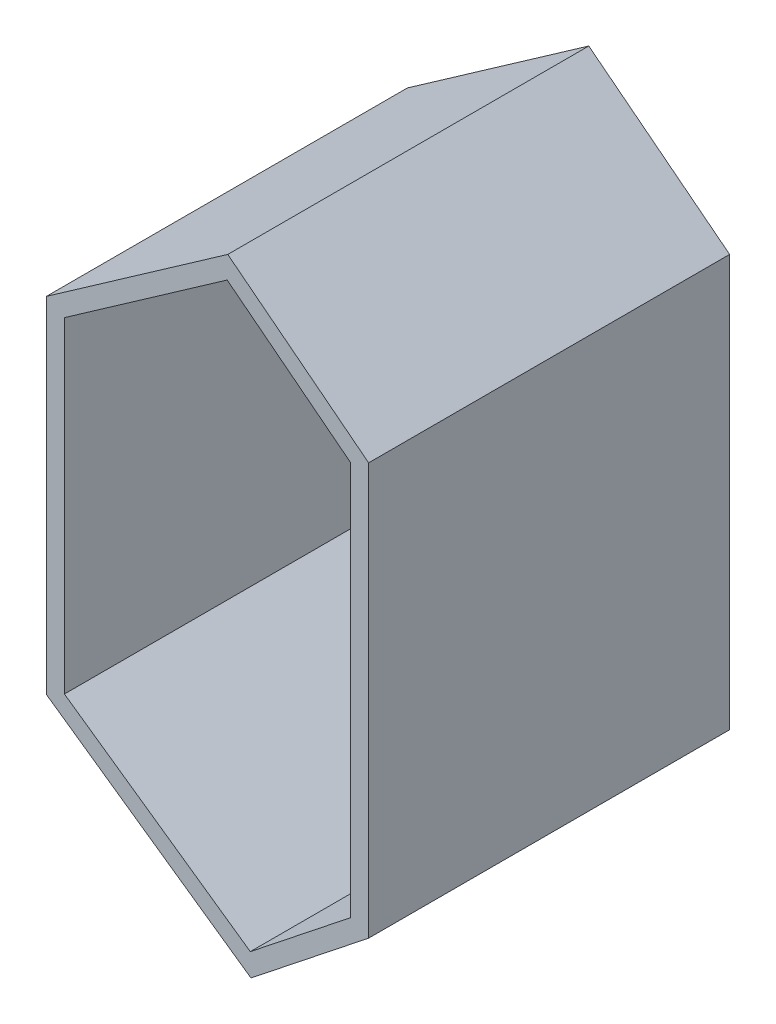
ISO-10303-21;
HEADER;
FILE_DESCRIPTION(('STEP AP214'),'2;1');
FILE_NAME('part.step','',(''),(''),'','','');
FILE_SCHEMA(('AUTOMOTIVE_DESIGN { 1 0 10303 214 1 1 1 1 }'));
ENDSEC;
DATA;
#1=APPLICATION_CONTEXT('core data for automotive mechanical design processes');
#2=APPLICATION_PROTOCOL_DEFINITION('international standard','automotive_design',2000,#1);
#3=PRODUCT_CONTEXT('',#1,'mechanical');
#4=PRODUCT('Part','Part','',(#3));
#5=PRODUCT_RELATED_PRODUCT_CATEGORY('part','',(#4));
#6=PRODUCT_DEFINITION_FORMATION('','',#4);
#7=PRODUCT_DEFINITION_CONTEXT('part definition',#1,'design');
#8=PRODUCT_DEFINITION('design','',#6,#7);
#9=PRODUCT_DEFINITION_SHAPE('','',#8);
#10=(LENGTH_UNIT() NAMED_UNIT(*) SI_UNIT(.MILLI.,.METRE.));
#11=(NAMED_UNIT(*) PLANE_ANGLE_UNIT() SI_UNIT($,.RADIAN.));
#12=(NAMED_UNIT(*) SI_UNIT($,.STERADIAN.) SOLID_ANGLE_UNIT());
#13=UNCERTAINTY_MEASURE_WITH_UNIT(LENGTH_MEASURE(1.E-05),#10,'distance_accuracy_value','');
#14=(GEOMETRIC_REPRESENTATION_CONTEXT(3) GLOBAL_UNCERTAINTY_ASSIGNED_CONTEXT((#13)) GLOBAL_UNIT_ASSIGNED_CONTEXT((#10,
#11,#12)) REPRESENTATION_CONTEXT('',''));
#15=CARTESIAN_POINT('',(0.,0.,0.));
#16=DIRECTION('',(0.,0.,1.));
#17=DIRECTION('',(1.,0.,0.));
#18=AXIS2_PLACEMENT_3D('',#15,#16,#17);
#19=CARTESIAN_POINT('',(0.,0.,12.));
#20=DIRECTION('',(0.,0.,1.));
#21=DIRECTION('',(1.,0.,0.));
#22=AXIS2_PLACEMENT_3D('',#19,#20,#21);
#23=PLANE('',#22);
#24=DIRECTION('',(0.,1.,0.));
#25=VECTOR('',#24,1.);
#26=CARTESIAN_POINT('',(23.0022153114489,-29.371596289084,12.));
#27=LINE('',#26,#25);
#28=CARTESIAN_POINT('',(23.0022153114489,-43.0552113023601,12.));
#29=VERTEX_POINT('',#28);
#30=CARTESIAN_POINT('',(23.0022153114489,-29.371596289084,12.));
#31=VERTEX_POINT('',#30);
#32=EDGE_CURVE('E175',#29,#31,#27,.T.);
#33=ORIENTED_EDGE('',*,*,#32,.T.);
#34=DIRECTION('',(-0.788010753606723,0.615661475325657,0.));
#35=VECTOR('',#34,1.);
#36=CARTESIAN_POINT('',(23.0022153114489,-29.371596289084,12.));
#37=LINE('',#36,#35);
#38=CARTESIAN_POINT('',(18.3200530199619,-25.7134901897735,12.));
#39=VERTEX_POINT('',#38);
#40=EDGE_CURVE('E178',#31,#39,#37,.T.);
#41=ORIENTED_EDGE('',*,*,#40,.T.);
#42=DIRECTION('',(-0.819152044288996,-0.57357643635104,0.));
#43=VECTOR('',#42,1.);
#44=CARTESIAN_POINT('',(18.3200530199619,-25.7134901897735,12.));
#45=LINE('',#44,#43);
#46=CARTESIAN_POINT('',(12.2903213629814,-29.935553749373,12.));
#47=VERTEX_POINT('',#46);
#48=EDGE_CURVE('E181',#39,#47,#45,.T.);
#49=ORIENTED_EDGE('',*,*,#48,.T.);
#50=DIRECTION('',(0.,-1.,0.));
#51=VECTOR('',#50,1.);
#52=CARTESIAN_POINT('',(12.2903213629814,-29.935553749373,12.));
#53=LINE('',#52,#51);
#54=CARTESIAN_POINT('',(12.2903213629814,-41.394710348046,12.));
#55=VERTEX_POINT('',#54);
#56=EDGE_CURVE('E183',#47,#55,#53,.T.);
#57=ORIENTED_EDGE('',*,*,#56,.T.);
#58=DIRECTION('',(0.819152044288993,-0.573576436351043,0.));
#59=VECTOR('',#58,1.);
#60=CARTESIAN_POINT('',(12.2903213629814,-41.394710348046,12.));
#61=LINE('',#60,#59);
#62=CARTESIAN_POINT('',(19.0912538792578,-46.1567745627982,12.));
#63=VERTEX_POINT('',#62);
#64=EDGE_CURVE('E185',#55,#63,#61,.T.);
#65=ORIENTED_EDGE('',*,*,#64,.T.);
#66=DIRECTION('',(0.783520476758646,0.621365965031803,0.));
#67=VECTOR('',#66,1.);
#68=CARTESIAN_POINT('',(23.0022153114489,-43.0552113023601,12.));
#69=LINE('',#68,#67);
#70=EDGE_CURVE('E187',#63,#29,#69,.T.);
#71=ORIENTED_EDGE('',*,*,#70,.T.);
#72=EDGE_LOOP('',(#33,#41,#49,#57,#65,#71));
#73=FACE_BOUND('',#72,.T.);
#74=DIRECTION('',(0.,-1.,0.));
#75=VECTOR('',#74,1.);
#76=CARTESIAN_POINT('',(12.8903213629814,-30.247893979704,12.));
#77=LINE('',#76,#75);
#78=CARTESIAN_POINT('',(12.8903213629814,-30.247893979704,12.));
#79=VERTEX_POINT('',#78);
#80=CARTESIAN_POINT('',(12.8903213629814,-41.082370117715,12.));
#81=VERTEX_POINT('',#80);
#82=EDGE_CURVE('E130',#79,#81,#77,.T.);
#83=ORIENTED_EDGE('',*,*,#82,.F.);
#84=DIRECTION('',(-0.819152044288999,-0.573576436351036,0.));
#85=VECTOR('',#84,1.);
#86=CARTESIAN_POINT('',(18.3005145053902,-26.4596359582189,12.));
#87=LINE('',#86,#85);
#88=CARTESIAN_POINT('',(18.3005145053902,-26.4596359582189,12.));
#89=VERTEX_POINT('',#88);
#90=EDGE_CURVE('E122',#89,#79,#87,.T.);
#91=ORIENTED_EDGE('',*,*,#90,.F.);
#92=DIRECTION('',(-0.788010753606723,0.615661475325657,0.));
#93=VECTOR('',#92,1.);
#94=CARTESIAN_POINT('',(22.4022153114489,-29.6642358422236,12.));
#95=LINE('',#94,#93);
#96=CARTESIAN_POINT('',(22.4022153114489,-29.6642358422236,12.));
#97=VERTEX_POINT('',#96);
#98=EDGE_CURVE('E152',#97,#89,#95,.T.);
#99=ORIENTED_EDGE('',*,*,#98,.F.);
#100=DIRECTION('',(0.,1.,0.));
#101=VECTOR('',#100,1.);
#102=CARTESIAN_POINT('',(22.4022153114489,-29.6642358422236,12.));
#103=LINE('',#102,#101);
#104=CARTESIAN_POINT('',(22.4022153114489,-42.7652630141919,12.));
#105=VERTEX_POINT('',#104);
#106=EDGE_CURVE('E150',#105,#97,#103,.T.);
#107=ORIENTED_EDGE('',*,*,#106,.F.);
#108=DIRECTION('',(0.783520476758647,0.621365965031802,0.));
#109=VECTOR('',#108,1.);
#110=CARTESIAN_POINT('',(22.4022153114489,-42.7652630141919,12.));
#111=LINE('',#110,#109);
#112=CARTESIAN_POINT('',(19.0689470198622,-45.4086903784388,12.));
#113=VERTEX_POINT('',#112);
#114=EDGE_CURVE('E146',#113,#105,#111,.T.);
#115=ORIENTED_EDGE('',*,*,#114,.F.);
#116=DIRECTION('',(0.819152044288994,-0.573576436351043,0.));
#117=VECTOR('',#116,1.);
#118=CARTESIAN_POINT('',(12.8903213629814,-41.082370117715,12.));
#119=LINE('',#118,#117);
#120=EDGE_CURVE('E144',#81,#113,#119,.T.);
#121=ORIENTED_EDGE('',*,*,#120,.F.);
#122=EDGE_LOOP('',(#83,#91,#99,#107,#115,#121));
#123=FACE_BOUND('',#122,.T.);
#124=ADVANCED_FACE('F35',(#73,#123),#23,.T.);
#125=CARTESIAN_POINT('',(0.,0.,0.));
#126=DIRECTION('',(0.,0.,1.));
#127=DIRECTION('',(1.,0.,0.));
#128=AXIS2_PLACEMENT_3D('',#125,#126,#127);
#129=PLANE('',#128);
#130=DIRECTION('',(0.,1.,0.));
#131=VECTOR('',#130,1.);
#132=CARTESIAN_POINT('',(23.0022153114489,-29.371596289084,0.));
#133=LINE('',#132,#131);
#134=CARTESIAN_POINT('',(23.0022153114489,-43.0552113023601,0.));
#135=VERTEX_POINT('',#134);
#136=CARTESIAN_POINT('',(23.0022153114489,-29.371596289084,0.));
#137=VERTEX_POINT('',#136);
#138=EDGE_CURVE('E139',#135,#137,#133,.T.);
#139=ORIENTED_EDGE('',*,*,#138,.F.);
#140=DIRECTION('',(0.783520476758646,0.621365965031803,0.));
#141=VECTOR('',#140,1.);
#142=CARTESIAN_POINT('',(23.0022153114489,-43.0552113023601,0.));
#143=LINE('',#142,#141);
#144=CARTESIAN_POINT('',(19.0912538792578,-46.1567745627982,0.));
#145=VERTEX_POINT('',#144);
#146=EDGE_CURVE('E179',#145,#135,#143,.T.);
#147=ORIENTED_EDGE('',*,*,#146,.F.);
#148=DIRECTION('',(0.819152044288993,-0.573576436351043,0.));
#149=VECTOR('',#148,1.);
#150=CARTESIAN_POINT('',(12.2903213629814,-41.394710348046,0.));
#151=LINE('',#150,#149);
#152=CARTESIAN_POINT('',(12.2903213629814,-41.394710348046,0.));
#153=VERTEX_POINT('',#152);
#154=EDGE_CURVE('E199',#153,#145,#151,.T.);
#155=ORIENTED_EDGE('',*,*,#154,.F.);
#156=DIRECTION('',(0.,-1.,0.));
#157=VECTOR('',#156,1.);
#158=CARTESIAN_POINT('',(12.2903213629814,-29.935553749373,0.));
#159=LINE('',#158,#157);
#160=CARTESIAN_POINT('',(12.2903213629814,-29.935553749373,0.));
#161=VERTEX_POINT('',#160);
#162=EDGE_CURVE('E197',#161,#153,#159,.T.);
#163=ORIENTED_EDGE('',*,*,#162,.F.);
#164=DIRECTION('',(-0.819152044288993,-0.573576436351044,0.));
#165=VECTOR('',#164,1.);
#166=CARTESIAN_POINT('',(17.8061046959484,-26.0733606804981,0.));
#167=LINE('',#166,#165);
#168=CARTESIAN_POINT('',(18.3200530199619,-25.7134901897735,0.));
#169=VERTEX_POINT('',#168);
#170=EDGE_CURVE('E195',#169,#161,#167,.T.);
#171=ORIENTED_EDGE('',*,*,#170,.F.);
#172=DIRECTION('',(-0.788010753606723,0.615661475325657,0.));
#173=VECTOR('',#172,1.);
#174=CARTESIAN_POINT('',(23.0022153114489,-29.371596289084,0.));
#175=LINE('',#174,#173);
#176=EDGE_CURVE('E192',#137,#169,#175,.T.);
#177=ORIENTED_EDGE('',*,*,#176,.F.);
#178=EDGE_LOOP('',(#139,#147,#155,#163,#171,#177));
#179=FACE_BOUND('',#178,.T.);
#180=DIRECTION('',(-0.819152044288993,-0.573576436351044,0.));
#181=VECTOR('',#180,1.);
#182=CARTESIAN_POINT('',(18.150250557759,-26.5648519070715,0.));
#183=LINE('',#182,#181);
#184=CARTESIAN_POINT('',(18.3005145053902,-26.4596359582189,0.));
#185=VERTEX_POINT('',#184);
#186=CARTESIAN_POINT('',(12.8903213629814,-30.247893979704,0.));
#187=VERTEX_POINT('',#186);
#188=EDGE_CURVE('E154',#185,#187,#183,.T.);
#189=ORIENTED_EDGE('',*,*,#188,.T.);
#190=DIRECTION('',(0.,-1.,0.));
#191=VECTOR('',#190,1.);
#192=CARTESIAN_POINT('',(12.8903213629814,-30.247893979704,0.));
#193=LINE('',#192,#191);
#194=CARTESIAN_POINT('',(12.8903213629814,-41.082370117715,0.));
#195=VERTEX_POINT('',#194);
#196=EDGE_CURVE('E137',#187,#195,#193,.T.);
#197=ORIENTED_EDGE('',*,*,#196,.T.);
#198=DIRECTION('',(0.819152044288994,-0.573576436351043,0.));
#199=VECTOR('',#198,1.);
#200=CARTESIAN_POINT('',(12.8903213629814,-41.082370117715,0.));
#201=LINE('',#200,#199);
#202=CARTESIAN_POINT('',(19.0689470198622,-45.4086903784388,0.));
#203=VERTEX_POINT('',#202);
#204=EDGE_CURVE('E157',#195,#203,#201,.T.);
#205=ORIENTED_EDGE('',*,*,#204,.T.);
#206=DIRECTION('',(0.783520476758647,0.621365965031802,0.));
#207=VECTOR('',#206,1.);
#208=CARTESIAN_POINT('',(22.4022153114489,-42.7652630141919,0.));
#209=LINE('',#208,#207);
#210=CARTESIAN_POINT('',(22.4022153114489,-42.7652630141919,0.));
#211=VERTEX_POINT('',#210);
#212=EDGE_CURVE('E160',#203,#211,#209,.T.);
#213=ORIENTED_EDGE('',*,*,#212,.T.);
#214=DIRECTION('',(0.,1.,0.));
#215=VECTOR('',#214,1.);
#216=CARTESIAN_POINT('',(22.4022153114489,-29.6642358422236,0.));
#217=LINE('',#216,#215);
#218=CARTESIAN_POINT('',(22.4022153114489,-29.6642358422236,0.));
#219=VERTEX_POINT('',#218);
#220=EDGE_CURVE('E163',#211,#219,#217,.T.);
#221=ORIENTED_EDGE('',*,*,#220,.T.);
#222=DIRECTION('',(-0.788010753606723,0.615661475325657,0.));
#223=VECTOR('',#222,1.);
#224=CARTESIAN_POINT('',(22.4022153114489,-29.6642358422236,0.));
#225=LINE('',#224,#223);
#226=EDGE_CURVE('E131',#219,#185,#225,.T.);
#227=ORIENTED_EDGE('',*,*,#226,.T.);
#228=EDGE_LOOP('',(#189,#197,#205,#213,#221,#227));
#229=FACE_BOUND('',#228,.T.);
#230=ADVANCED_FACE('F223',(#179,#229),#129,.F.);
#231=CARTESIAN_POINT('',(23.0022153114489,-29.371596289084,12.));
#232=DIRECTION('',(-1.,0.,0.));
#233=DIRECTION('',(0.,-1.,0.));
#234=AXIS2_PLACEMENT_3D('',#231,#232,#233);
#235=PLANE('',#234);
#236=ORIENTED_EDGE('',*,*,#138,.T.);
#237=DIRECTION('',(0.,0.,-1.));
#238=VECTOR('',#237,1.);
#239=CARTESIAN_POINT('',(23.0022153114489,-29.371596289084,12.));
#240=LINE('',#239,#238);
#241=EDGE_CURVE('E11',#31,#137,#240,.T.);
#242=ORIENTED_EDGE('',*,*,#241,.F.);
#243=ORIENTED_EDGE('',*,*,#32,.F.);
#244=DIRECTION('',(0.,0.,-1.));
#245=VECTOR('',#244,1.);
#246=CARTESIAN_POINT('',(23.0022153114489,-43.0552113023601,12.));
#247=LINE('',#246,#245);
#248=EDGE_CURVE('E189',#29,#135,#247,.T.);
#249=ORIENTED_EDGE('',*,*,#248,.T.);
#250=EDGE_LOOP('',(#236,#242,#243,#249));
#251=FACE_BOUND('',#250,.T.);
#252=ADVANCED_FACE('F37',(#251),#235,.F.);
#253=CARTESIAN_POINT('',(23.0022153114489,-29.371596289084,12.));
#254=DIRECTION('',(-0.615661475325657,-0.788010753606723,0.));
#255=DIRECTION('',(0.788010753606723,-0.615661475325657,0.));
#256=AXIS2_PLACEMENT_3D('',#253,#254,#255);
#257=PLANE('',#256);
#258=ORIENTED_EDGE('',*,*,#176,.T.);
#259=DIRECTION('',(0.,0.,-1.));
#260=VECTOR('',#259,1.);
#261=CARTESIAN_POINT('',(18.3200530199619,-25.7134901897735,12.));
#262=LINE('',#261,#260);
#263=EDGE_CURVE('E43',#39,#169,#262,.T.);
#264=ORIENTED_EDGE('',*,*,#263,.F.);
#265=ORIENTED_EDGE('',*,*,#40,.F.);
#266=ORIENTED_EDGE('',*,*,#241,.T.);
#267=EDGE_LOOP('',(#258,#264,#265,#266));
#268=FACE_BOUND('',#267,.T.);
#269=ADVANCED_FACE('F219',(#268),#257,.F.);
#270=CARTESIAN_POINT('',(17.8061046959484,-26.0733606804981,12.));
#271=DIRECTION('',(0.573576436351044,-0.819152044288993,0.));
#272=DIRECTION('',(0.819152044288994,0.573576436351044,0.));
#273=AXIS2_PLACEMENT_3D('',#270,#271,#272);
#274=PLANE('',#273);
#275=ORIENTED_EDGE('',*,*,#170,.T.);
#276=DIRECTION('',(0.,0.,-1.));
#277=VECTOR('',#276,1.);
#278=CARTESIAN_POINT('',(12.2903213629814,-29.935553749373,12.));
#279=LINE('',#278,#277);
#280=EDGE_CURVE('E210',#47,#161,#279,.T.);
#281=ORIENTED_EDGE('',*,*,#280,.F.);
#282=ORIENTED_EDGE('',*,*,#48,.F.);
#283=ORIENTED_EDGE('',*,*,#263,.T.);
#284=EDGE_LOOP('',(#275,#281,#282,#283));
#285=FACE_BOUND('',#284,.T.);
#286=ADVANCED_FACE('F216',(#285),#274,.F.);
#287=CARTESIAN_POINT('',(12.2903213629814,-29.935553749373,12.));
#288=DIRECTION('',(1.,0.,0.));
#289=DIRECTION('',(0.,1.,0.));
#290=AXIS2_PLACEMENT_3D('',#287,#288,#289);
#291=PLANE('',#290);
#292=ORIENTED_EDGE('',*,*,#162,.T.);
#293=DIRECTION('',(0.,0.,-1.));
#294=VECTOR('',#293,1.);
#295=CARTESIAN_POINT('',(12.2903213629814,-41.394710348046,12.));
#296=LINE('',#295,#294);
#297=EDGE_CURVE('E207',#55,#153,#296,.T.);
#298=ORIENTED_EDGE('',*,*,#297,.F.);
#299=ORIENTED_EDGE('',*,*,#56,.F.);
#300=ORIENTED_EDGE('',*,*,#280,.T.);
#301=EDGE_LOOP('',(#292,#298,#299,#300));
#302=FACE_BOUND('',#301,.T.);
#303=ADVANCED_FACE('F230',(#302),#291,.F.);
#304=CARTESIAN_POINT('',(12.2903213629814,-41.394710348046,12.));
#305=DIRECTION('',(0.573576436351044,0.819152044288993,0.));
#306=DIRECTION('',(-0.819152044288994,0.573576436351044,0.));
#307=AXIS2_PLACEMENT_3D('',#304,#305,#306);
#308=PLANE('',#307);
#309=ORIENTED_EDGE('',*,*,#154,.T.);
#310=DIRECTION('',(0.,0.,-1.));
#311=VECTOR('',#310,1.);
#312=CARTESIAN_POINT('',(19.0912538792578,-46.1567745627982,12.));
#313=LINE('',#312,#311);
#314=EDGE_CURVE('E204',#63,#145,#313,.T.);
#315=ORIENTED_EDGE('',*,*,#314,.F.);
#316=ORIENTED_EDGE('',*,*,#64,.F.);
#317=ORIENTED_EDGE('',*,*,#297,.T.);
#318=EDGE_LOOP('',(#309,#315,#316,#317));
#319=FACE_BOUND('',#318,.T.);
#320=ADVANCED_FACE('F234',(#319),#308,.F.);
#321=CARTESIAN_POINT('',(23.0022153114489,-43.0552113023601,12.));
#322=DIRECTION('',(-0.621365965031803,0.783520476758646,0.));
#323=DIRECTION('',(-0.783520476758646,-0.621365965031803,0.));
#324=AXIS2_PLACEMENT_3D('',#321,#322,#323);
#325=PLANE('',#324);
#326=ORIENTED_EDGE('',*,*,#146,.T.);
#327=ORIENTED_EDGE('',*,*,#248,.F.);
#328=ORIENTED_EDGE('',*,*,#70,.F.);
#329=ORIENTED_EDGE('',*,*,#314,.T.);
#330=EDGE_LOOP('',(#326,#327,#328,#329));
#331=FACE_BOUND('',#330,.T.);
#332=ADVANCED_FACE('F242',(#331),#325,.F.);
#333=CARTESIAN_POINT('',(18.150250557759,-26.5648519070715,12.));
#334=DIRECTION('',(0.573576436351044,-0.819152044288993,0.));
#335=DIRECTION('',(0.819152044288993,0.573576436351044,0.));
#336=AXIS2_PLACEMENT_3D('',#333,#334,#335);
#337=PLANE('',#336);
#338=ORIENTED_EDGE('',*,*,#188,.F.);
#339=DIRECTION('',(0.,0.,-1.));
#340=VECTOR('',#339,1.);
#341=CARTESIAN_POINT('',(18.3005145053902,-26.4596359582189,12.));
#342=LINE('',#341,#340);
#343=EDGE_CURVE('E55',#89,#185,#342,.T.);
#344=ORIENTED_EDGE('',*,*,#343,.F.);
#345=ORIENTED_EDGE('',*,*,#90,.T.);
#346=DIRECTION('',(0.,0.,-1.));
#347=VECTOR('',#346,1.);
#348=CARTESIAN_POINT('',(12.8903213629814,-30.247893979704,12.));
#349=LINE('',#348,#347);
#350=EDGE_CURVE('E125',#79,#187,#349,.T.);
#351=ORIENTED_EDGE('',*,*,#350,.T.);
#352=EDGE_LOOP('',(#338,#344,#345,#351));
#353=FACE_BOUND('',#352,.T.);
#354=ADVANCED_FACE('F124',(#353),#337,.T.);
#355=CARTESIAN_POINT('',(12.8903213629814,-30.247893979704,12.));
#356=DIRECTION('',(1.,0.,0.));
#357=DIRECTION('',(0.,0.,-1.));
#358=AXIS2_PLACEMENT_3D('',#355,#356,#357);
#359=PLANE('',#358);
#360=ORIENTED_EDGE('',*,*,#196,.F.);
#361=ORIENTED_EDGE('',*,*,#350,.F.);
#362=ORIENTED_EDGE('',*,*,#82,.T.);
#363=DIRECTION('',(0.,0.,-1.));
#364=VECTOR('',#363,1.);
#365=CARTESIAN_POINT('',(12.8903213629814,-41.082370117715,12.));
#366=LINE('',#365,#364);
#367=EDGE_CURVE('E140',#81,#195,#366,.T.);
#368=ORIENTED_EDGE('',*,*,#367,.T.);
#369=EDGE_LOOP('',(#360,#361,#362,#368));
#370=FACE_BOUND('',#369,.T.);
#371=ADVANCED_FACE('F134',(#370),#359,.T.);
#372=CARTESIAN_POINT('',(12.8903213629814,-41.082370117715,12.));
#373=DIRECTION('',(0.573576436351043,0.819152044288994,0.));
#374=DIRECTION('',(-0.819152044288994,0.573576436351043,0.));
#375=AXIS2_PLACEMENT_3D('',#372,#373,#374);
#376=PLANE('',#375);
#377=ORIENTED_EDGE('',*,*,#204,.F.);
#378=ORIENTED_EDGE('',*,*,#367,.F.);
#379=ORIENTED_EDGE('',*,*,#120,.T.);
#380=DIRECTION('',(0.,0.,-1.));
#381=VECTOR('',#380,1.);
#382=CARTESIAN_POINT('',(19.0689470198622,-45.4086903784388,12.));
#383=LINE('',#382,#381);
#384=EDGE_CURVE('E172',#113,#203,#383,.T.);
#385=ORIENTED_EDGE('',*,*,#384,.T.);
#386=EDGE_LOOP('',(#377,#378,#379,#385));
#387=FACE_BOUND('',#386,.T.);
#388=ADVANCED_FACE('F260',(#387),#376,.T.);
#389=CARTESIAN_POINT('',(22.4022153114489,-42.7652630141919,12.));
#390=DIRECTION('',(-0.621365965031802,0.783520476758647,0.));
#391=DIRECTION('',(-0.783520476758647,-0.621365965031802,0.));
#392=AXIS2_PLACEMENT_3D('',#389,#390,#391);
#393=PLANE('',#392);
#394=ORIENTED_EDGE('',*,*,#212,.F.);
#395=ORIENTED_EDGE('',*,*,#384,.F.);
#396=ORIENTED_EDGE('',*,*,#114,.T.);
#397=DIRECTION('',(0.,0.,-1.));
#398=VECTOR('',#397,1.);
#399=CARTESIAN_POINT('',(22.4022153114489,-42.7652630141919,12.));
#400=LINE('',#399,#398);
#401=EDGE_CURVE('E170',#105,#211,#400,.T.);
#402=ORIENTED_EDGE('',*,*,#401,.T.);
#403=EDGE_LOOP('',(#394,#395,#396,#402));
#404=FACE_BOUND('',#403,.T.);
#405=ADVANCED_FACE('F263',(#404),#393,.T.);
#406=CARTESIAN_POINT('',(22.4022153114489,-29.6642358422236,12.));
#407=DIRECTION('',(-1.,0.,0.));
#408=DIRECTION('',(0.,0.,1.));
#409=AXIS2_PLACEMENT_3D('',#406,#407,#408);
#410=PLANE('',#409);
#411=ORIENTED_EDGE('',*,*,#220,.F.);
#412=ORIENTED_EDGE('',*,*,#401,.F.);
#413=ORIENTED_EDGE('',*,*,#106,.T.);
#414=DIRECTION('',(0.,0.,-1.));
#415=VECTOR('',#414,1.);
#416=CARTESIAN_POINT('',(22.4022153114489,-29.6642358422236,12.));
#417=LINE('',#416,#415);
#418=EDGE_CURVE('E50',#97,#219,#417,.T.);
#419=ORIENTED_EDGE('',*,*,#418,.T.);
#420=EDGE_LOOP('',(#411,#412,#413,#419));
#421=FACE_BOUND('',#420,.T.);
#422=ADVANCED_FACE('F267',(#421),#410,.T.);
#423=CARTESIAN_POINT('',(22.4022153114489,-29.6642358422236,12.));
#424=DIRECTION('',(-0.615661475325657,-0.788010753606723,0.));
#425=DIRECTION('',(0.788010753606723,-0.615661475325657,0.));
#426=AXIS2_PLACEMENT_3D('',#423,#424,#425);
#427=PLANE('',#426);
#428=ORIENTED_EDGE('',*,*,#226,.F.);
#429=ORIENTED_EDGE('',*,*,#418,.F.);
#430=ORIENTED_EDGE('',*,*,#98,.T.);
#431=ORIENTED_EDGE('',*,*,#343,.T.);
#432=EDGE_LOOP('',(#428,#429,#430,#431));
#433=FACE_BOUND('',#432,.T.);
#434=ADVANCED_FACE('F271',(#433),#427,.T.);
#435=CLOSED_SHELL('',(#124,#230,#252,#269,#286,#303,#320,#332,#354,#371,#388,#405,#422,#434));
#436=MANIFOLD_SOLID_BREP('B2',#435);
#437=ADVANCED_BREP_SHAPE_REPRESENTATION('',(#18,#436),#14);
#438=SHAPE_DEFINITION_REPRESENTATION(#9,#437);
ENDSEC;
END-ISO-10303-21;
